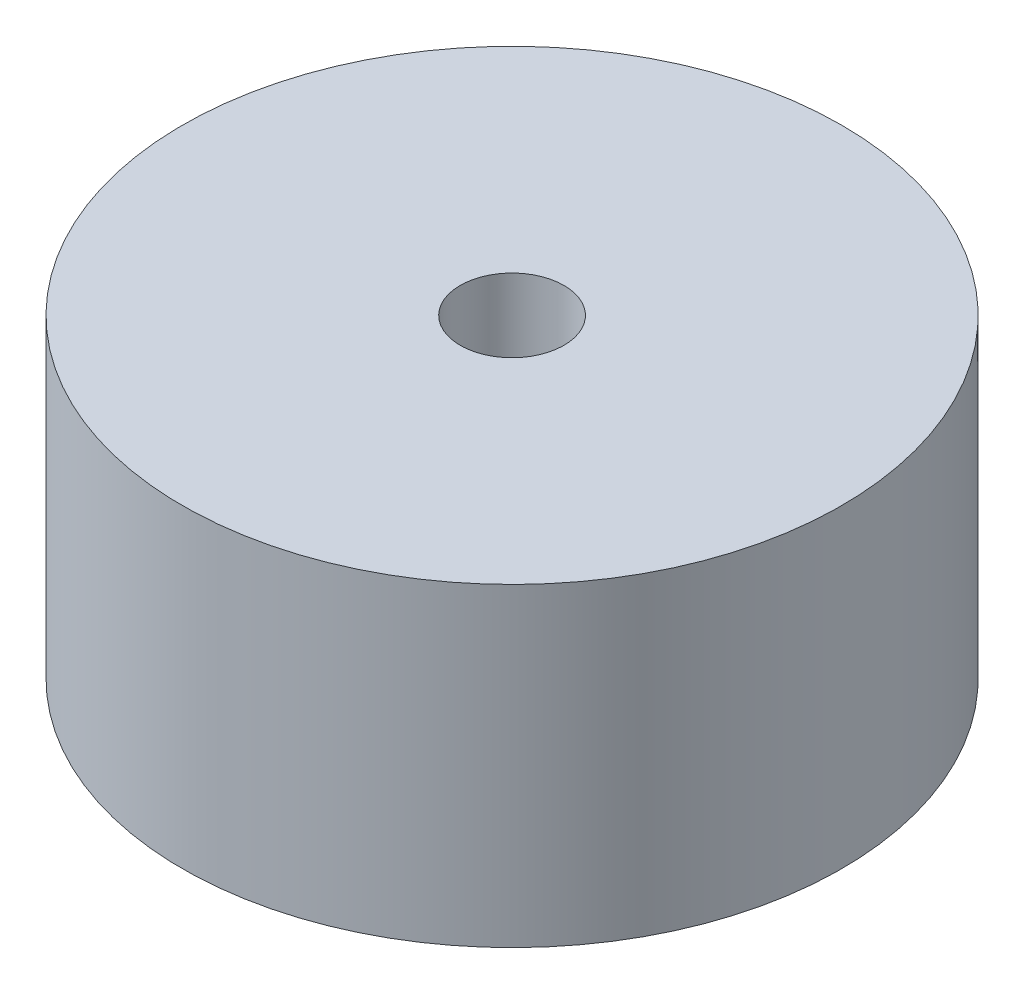
ISO-10303-21;
HEADER;
FILE_DESCRIPTION(('STEP AP214'),'2;1');
FILE_NAME('part.step','',(''),(''),'','','');
FILE_SCHEMA(('AUTOMOTIVE_DESIGN { 1 0 10303 214 1 1 1 1 }'));
ENDSEC;
DATA;
#1=APPLICATION_CONTEXT('core data for automotive mechanical design processes');
#2=APPLICATION_PROTOCOL_DEFINITION('international standard','automotive_design',2000,#1);
#3=PRODUCT_CONTEXT('',#1,'mechanical');
#4=PRODUCT('Part','Part','',(#3));
#5=PRODUCT_RELATED_PRODUCT_CATEGORY('part','',(#4));
#6=PRODUCT_DEFINITION_FORMATION('','',#4);
#7=PRODUCT_DEFINITION_CONTEXT('part definition',#1,'design');
#8=PRODUCT_DEFINITION('design','',#6,#7);
#9=PRODUCT_DEFINITION_SHAPE('','',#8);
#10=(LENGTH_UNIT() NAMED_UNIT(*) SI_UNIT(.MILLI.,.METRE.));
#11=(NAMED_UNIT(*) PLANE_ANGLE_UNIT() SI_UNIT($,.RADIAN.));
#12=(NAMED_UNIT(*) SI_UNIT($,.STERADIAN.) SOLID_ANGLE_UNIT());
#13=UNCERTAINTY_MEASURE_WITH_UNIT(LENGTH_MEASURE(1.E-05),#10,'distance_accuracy_value','');
#14=(GEOMETRIC_REPRESENTATION_CONTEXT(3) GLOBAL_UNCERTAINTY_ASSIGNED_CONTEXT((#13)) GLOBAL_UNIT_ASSIGNED_CONTEXT((#10,
#11,#12)) REPRESENTATION_CONTEXT('',''));
#15=CARTESIAN_POINT('',(0.,0.,0.));
#16=DIRECTION('',(0.,0.,1.));
#17=DIRECTION('',(1.,0.,0.));
#18=AXIS2_PLACEMENT_3D('',#15,#16,#17);
#19=CARTESIAN_POINT('',(0.,30.3,0.));
#20=DIRECTION('',(0.,-1.,0.));
#21=DIRECTION('',(0.,0.,-1.));
#22=AXIS2_PLACEMENT_3D('',#19,#20,#21);
#23=CYLINDRICAL_SURFACE('',#22,31.75);
#24=CARTESIAN_POINT('',(0.,30.3,0.));
#25=DIRECTION('',(0.,1.,0.));
#26=DIRECTION('',(0.,0.,1.));
#27=AXIS2_PLACEMENT_3D('',#24,#25,#26);
#28=CIRCLE('',#27,31.75);
#29=CARTESIAN_POINT('',(0.,30.3,-31.75));
#30=VERTEX_POINT('',#29);
#31=EDGE_CURVE('E10',#30,#30,#28,.T.);
#32=CARTESIAN_POINT('',(0.,0.,0.));
#33=DIRECTION('',(0.,1.,0.));
#34=DIRECTION('',(0.,0.,1.));
#35=AXIS2_PLACEMENT_3D('',#32,#33,#34);
#36=CIRCLE('',#35,31.75);
#37=CARTESIAN_POINT('',(0.,0.,-31.75));
#38=VERTEX_POINT('',#37);
#39=EDGE_CURVE('E39',#38,#38,#36,.T.);
#40=CARTESIAN_POINT('',(0.,30.3,-31.75));
#41=CARTESIAN_POINT('',(0.,29.984375,-31.75));
#42=CARTESIAN_POINT('',(0.,29.66875,-31.75));
#43=CARTESIAN_POINT('',(0.,29.0375,-31.75));
#44=CARTESIAN_POINT('',(0.,28.721875,-31.75));
#45=CARTESIAN_POINT('',(0.,28.090625,-31.75));
#46=CARTESIAN_POINT('',(0.,27.775,-31.75));
#47=CARTESIAN_POINT('',(0.,27.14375,-31.75));
#48=CARTESIAN_POINT('',(0.,26.828125,-31.75));
#49=CARTESIAN_POINT('',(0.,26.196875,-31.75));
#50=CARTESIAN_POINT('',(0.,25.88125,-31.75));
#51=CARTESIAN_POINT('',(0.,25.25,-31.75));
#52=CARTESIAN_POINT('',(0.,24.934375,-31.75));
#53=CARTESIAN_POINT('',(0.,24.303125,-31.75));
#54=CARTESIAN_POINT('',(0.,23.9875,-31.75));
#55=CARTESIAN_POINT('',(0.,23.35625,-31.75));
#56=CARTESIAN_POINT('',(0.,23.040625,-31.75));
#57=CARTESIAN_POINT('',(0.,22.409375,-31.75));
#58=CARTESIAN_POINT('',(0.,22.09375,-31.75));
#59=CARTESIAN_POINT('',(0.,21.4625,-31.75));
#60=CARTESIAN_POINT('',(0.,21.146875,-31.75));
#61=CARTESIAN_POINT('',(0.,20.515625,-31.75));
#62=CARTESIAN_POINT('',(0.,20.2,-31.75));
#63=CARTESIAN_POINT('',(0.,19.56875,-31.75));
#64=CARTESIAN_POINT('',(0.,19.253125,-31.75));
#65=CARTESIAN_POINT('',(0.,18.621875,-31.75));
#66=CARTESIAN_POINT('',(0.,18.30625,-31.75));
#67=CARTESIAN_POINT('',(0.,17.675,-31.75));
#68=CARTESIAN_POINT('',(0.,17.359375,-31.75));
#69=CARTESIAN_POINT('',(0.,16.728125,-31.75));
#70=CARTESIAN_POINT('',(0.,16.4125,-31.75));
#71=CARTESIAN_POINT('',(0.,15.78125,-31.75));
#72=CARTESIAN_POINT('',(0.,15.465625,-31.75));
#73=CARTESIAN_POINT('',(0.,14.834375,-31.75));
#74=CARTESIAN_POINT('',(0.,14.51875,-31.75));
#75=CARTESIAN_POINT('',(0.,13.8875,-31.75));
#76=CARTESIAN_POINT('',(0.,13.571875,-31.75));
#77=CARTESIAN_POINT('',(0.,12.940625,-31.75));
#78=CARTESIAN_POINT('',(0.,12.625,-31.75));
#79=CARTESIAN_POINT('',(0.,11.99375,-31.75));
#80=CARTESIAN_POINT('',(0.,11.678125,-31.75));
#81=CARTESIAN_POINT('',(0.,11.046875,-31.75));
#82=CARTESIAN_POINT('',(0.,10.73125,-31.75));
#83=CARTESIAN_POINT('',(0.,10.1,-31.75));
#84=CARTESIAN_POINT('',(0.,9.784375,-31.75));
#85=CARTESIAN_POINT('',(0.,9.153125,-31.75));
#86=CARTESIAN_POINT('',(0.,8.8375,-31.75));
#87=CARTESIAN_POINT('',(0.,8.20625,-31.75));
#88=CARTESIAN_POINT('',(0.,7.890625,-31.75));
#89=CARTESIAN_POINT('',(0.,7.259375,-31.75));
#90=CARTESIAN_POINT('',(0.,6.94375,-31.75));
#91=CARTESIAN_POINT('',(0.,6.3125,-31.75));
#92=CARTESIAN_POINT('',(0.,5.996875,-31.75));
#93=CARTESIAN_POINT('',(0.,5.365625,-31.75));
#94=CARTESIAN_POINT('',(0.,5.05,-31.75));
#95=CARTESIAN_POINT('',(0.,4.41875,-31.75));
#96=CARTESIAN_POINT('',(0.,4.103125,-31.75));
#97=CARTESIAN_POINT('',(0.,3.471875,-31.75));
#98=CARTESIAN_POINT('',(0.,3.15625,-31.75));
#99=CARTESIAN_POINT('',(0.,2.525,-31.75));
#100=CARTESIAN_POINT('',(0.,2.209375,-31.75));
#101=CARTESIAN_POINT('',(0.,1.578125,-31.75));
#102=CARTESIAN_POINT('',(0.,1.2625,-31.75));
#103=CARTESIAN_POINT('',(0.,0.631249999999997,-31.75));
#104=CARTESIAN_POINT('',(0.,0.315624999999997,-31.75));
#105=CARTESIAN_POINT('',(0.,0.,-31.75));
#106=B_SPLINE_CURVE_WITH_KNOTS('',3,(#40,#41,#42,#43,#44,#45,#46,#47,#48,#49,#50,#51,#52,#53,
#54,#55,#56,#57,#58,#59,#60,#61,#62,#63,#64,#65,#66,#67,#68,#69,#70,#71,#72,#73,#74,#75,#76,#77,
#78,#79,#80,#81,#82,#83,#84,#85,#86,#87,#88,#89,#90,#91,#92,#93,#94,#95,#96,#97,#98,#99,#100,
#101,#102,#103,#104,#105),.UNSPECIFIED.,.F.,.F.,(4,2,2,2,2,2,2,2,2,2,2,2,2,2,2,2,2,2,2,2,2,2,2,
2,2,2,2,2,2,2,2,2,4),(0.,0.946875,1.89375,2.840625,3.7875,4.734375,5.68125,6.628125,7.575,
8.521875,9.46875,10.415625,11.3625,12.309375,13.25625,14.203125,15.15,16.096875,17.04375,
17.990625,18.9375,19.884375,20.83125,21.778125,22.725,23.671875,24.61875,25.565625,26.5125,
27.459375,28.40625,29.353125,30.3),.UNSPECIFIED.);
#107=EDGE_CURVE('BSEAM38',#30,#38,#106,.T.);
#108=ORIENTED_EDGE('',*,*,#31,.F.);
#109=ORIENTED_EDGE('',*,*,#39,.T.);
#110=ORIENTED_EDGE('',*,*,#107,.T.);
#111=ORIENTED_EDGE('',*,*,#107,.F.);
#112=EDGE_LOOP('',(#108,#110,#109,#111));
#113=FACE_BOUND('',#112,.T.);
#114=ADVANCED_FACE('F38',(#113),#23,.T.);
#115=CARTESIAN_POINT('',(0.,30.3,0.));
#116=DIRECTION('',(0.,1.,0.));
#117=DIRECTION('',(0.,0.,1.));
#118=AXIS2_PLACEMENT_3D('',#115,#116,#117);
#119=PLANE('',#118);
#120=CARTESIAN_POINT('',(0.,30.3,0.));
#121=DIRECTION('',(0.,-1.,0.));
#122=DIRECTION('',(0.,0.,-1.));
#123=AXIS2_PLACEMENT_3D('',#120,#121,#122);
#124=CIRCLE('',#123,5.);
#125=CARTESIAN_POINT('',(0.,30.3,-5.));
#126=VERTEX_POINT('',#125);
#127=EDGE_CURVE('E46',#126,#126,#124,.T.);
#128=ORIENTED_EDGE('',*,*,#127,.T.);
#129=EDGE_LOOP('',(#128));
#130=FACE_BOUND('',#129,.T.);
#131=ORIENTED_EDGE('',*,*,#31,.T.);
#132=EDGE_LOOP('',(#131));
#133=FACE_BOUND('',#132,.T.);
#134=ADVANCED_FACE('F53',(#130,#133),#119,.T.);
#135=CARTESIAN_POINT('',(0.,0.,0.));
#136=DIRECTION('',(0.,1.,0.));
#137=DIRECTION('',(0.,0.,1.));
#138=AXIS2_PLACEMENT_3D('',#135,#136,#137);
#139=PLANE('',#138);
#140=CARTESIAN_POINT('',(0.,0.,0.));
#141=DIRECTION('',(0.,-1.,0.));
#142=DIRECTION('',(0.,0.,-1.));
#143=AXIS2_PLACEMENT_3D('',#140,#141,#142);
#144=CIRCLE('',#143,5.);
#145=CARTESIAN_POINT('',(0.,0.,-5.));
#146=VERTEX_POINT('',#145);
#147=EDGE_CURVE('E48',#146,#146,#144,.T.);
#148=ORIENTED_EDGE('',*,*,#147,.F.);
#149=EDGE_LOOP('',(#148));
#150=FACE_BOUND('',#149,.T.);
#151=ORIENTED_EDGE('',*,*,#39,.F.);
#152=EDGE_LOOP('',(#151));
#153=FACE_BOUND('',#152,.T.);
#154=ADVANCED_FACE('F56',(#150,#153),#139,.F.);
#155=CARTESIAN_POINT('',(0.,30.3,0.));
#156=DIRECTION('',(0.,-1.,0.));
#157=DIRECTION('',(0.,0.,-1.));
#158=AXIS2_PLACEMENT_3D('',#155,#156,#157);
#159=CYLINDRICAL_SURFACE('',#158,5.);
#160=CARTESIAN_POINT('',(0.,30.3,-5.));
#161=CARTESIAN_POINT('',(0.,29.984375,-5.));
#162=CARTESIAN_POINT('',(0.,29.66875,-5.));
#163=CARTESIAN_POINT('',(0.,29.0375,-5.));
#164=CARTESIAN_POINT('',(0.,28.721875,-5.));
#165=CARTESIAN_POINT('',(0.,28.090625,-5.));
#166=CARTESIAN_POINT('',(0.,27.775,-5.));
#167=CARTESIAN_POINT('',(0.,27.14375,-5.));
#168=CARTESIAN_POINT('',(0.,26.828125,-5.));
#169=CARTESIAN_POINT('',(0.,26.196875,-5.));
#170=CARTESIAN_POINT('',(0.,25.88125,-5.));
#171=CARTESIAN_POINT('',(0.,25.25,-5.));
#172=CARTESIAN_POINT('',(0.,24.934375,-5.));
#173=CARTESIAN_POINT('',(0.,24.303125,-5.));
#174=CARTESIAN_POINT('',(0.,23.9875,-5.));
#175=CARTESIAN_POINT('',(0.,23.35625,-5.));
#176=CARTESIAN_POINT('',(0.,23.040625,-5.));
#177=CARTESIAN_POINT('',(0.,22.409375,-5.));
#178=CARTESIAN_POINT('',(0.,22.09375,-5.));
#179=CARTESIAN_POINT('',(0.,21.4625,-5.));
#180=CARTESIAN_POINT('',(0.,21.146875,-5.));
#181=CARTESIAN_POINT('',(0.,20.515625,-5.));
#182=CARTESIAN_POINT('',(0.,20.2,-5.));
#183=CARTESIAN_POINT('',(0.,19.56875,-5.));
#184=CARTESIAN_POINT('',(0.,19.253125,-5.));
#185=CARTESIAN_POINT('',(0.,18.621875,-5.));
#186=CARTESIAN_POINT('',(0.,18.30625,-5.));
#187=CARTESIAN_POINT('',(0.,17.675,-5.));
#188=CARTESIAN_POINT('',(0.,17.359375,-5.));
#189=CARTESIAN_POINT('',(0.,16.728125,-5.));
#190=CARTESIAN_POINT('',(0.,16.4125,-5.));
#191=CARTESIAN_POINT('',(0.,15.78125,-5.));
#192=CARTESIAN_POINT('',(0.,15.465625,-5.));
#193=CARTESIAN_POINT('',(0.,14.834375,-5.));
#194=CARTESIAN_POINT('',(0.,14.51875,-5.));
#195=CARTESIAN_POINT('',(0.,13.8875,-5.));
#196=CARTESIAN_POINT('',(0.,13.571875,-5.));
#197=CARTESIAN_POINT('',(0.,12.940625,-5.));
#198=CARTESIAN_POINT('',(0.,12.625,-5.));
#199=CARTESIAN_POINT('',(0.,11.99375,-5.));
#200=CARTESIAN_POINT('',(0.,11.678125,-5.));
#201=CARTESIAN_POINT('',(0.,11.046875,-5.));
#202=CARTESIAN_POINT('',(0.,10.73125,-5.));
#203=CARTESIAN_POINT('',(0.,10.1,-5.));
#204=CARTESIAN_POINT('',(0.,9.784375,-5.));
#205=CARTESIAN_POINT('',(0.,9.153125,-5.));
#206=CARTESIAN_POINT('',(0.,8.83750000000001,-5.));
#207=CARTESIAN_POINT('',(0.,8.20625,-5.));
#208=CARTESIAN_POINT('',(0.,7.890625,-5.));
#209=CARTESIAN_POINT('',(0.,7.259375,-5.));
#210=CARTESIAN_POINT('',(0.,6.94375,-5.));
#211=CARTESIAN_POINT('',(0.,6.3125,-5.));
#212=CARTESIAN_POINT('',(0.,5.996875,-5.));
#213=CARTESIAN_POINT('',(0.,5.365625,-5.));
#214=CARTESIAN_POINT('',(0.,5.05,-5.));
#215=CARTESIAN_POINT('',(0.,4.41875,-5.));
#216=CARTESIAN_POINT('',(0.,4.103125,-5.));
#217=CARTESIAN_POINT('',(0.,3.471875,-5.));
#218=CARTESIAN_POINT('',(0.,3.15625,-5.));
#219=CARTESIAN_POINT('',(0.,2.525,-5.));
#220=CARTESIAN_POINT('',(0.,2.209375,-5.));
#221=CARTESIAN_POINT('',(0.,1.578125,-5.));
#222=CARTESIAN_POINT('',(0.,1.2625,-5.));
#223=CARTESIAN_POINT('',(0.,0.631250000000004,-5.));
#224=CARTESIAN_POINT('',(0.,0.315625000000004,-5.));
#225=CARTESIAN_POINT('',(0.,0.,-5.));
#226=B_SPLINE_CURVE_WITH_KNOTS('',3,(#160,#161,#162,#163,#164,#165,#166,#167,#168,#169,#170,
#171,#172,#173,#174,#175,#176,#177,#178,#179,#180,#181,#182,#183,#184,#185,#186,#187,#188,#189,
#190,#191,#192,#193,#194,#195,#196,#197,#198,#199,#200,#201,#202,#203,#204,#205,#206,#207,#208,
#209,#210,#211,#212,#213,#214,#215,#216,#217,#218,#219,#220,#221,#222,#223,#224,#225),
.UNSPECIFIED.,.F.,.F.,(4,2,2,2,2,2,2,2,2,2,2,2,2,2,2,2,2,2,2,2,2,2,2,2,2,2,2,2,2,2,2,2,4),(0.,
0.946875,1.89375,2.840625,3.7875,4.734375,5.68125,6.628125,7.575,8.521875,9.46875,10.415625,
11.3625,12.309375,13.25625,14.203125,15.15,16.096875,17.04375,17.990625,18.9375,19.884375,
20.83125,21.778125,22.725,23.671875,24.61875,25.565625,26.5125,27.459375,28.40625,29.353125,
30.3),.UNSPECIFIED.);
#227=EDGE_CURVE('BSEAM57',#126,#146,#226,.T.);
#228=ORIENTED_EDGE('',*,*,#127,.F.);
#229=ORIENTED_EDGE('',*,*,#147,.T.);
#230=ORIENTED_EDGE('',*,*,#227,.T.);
#231=ORIENTED_EDGE('',*,*,#227,.F.);
#232=EDGE_LOOP('',(#228,#230,#229,#231));
#233=FACE_BOUND('',#232,.T.);
#234=ADVANCED_FACE('F57',(#233),#159,.F.);
#235=CLOSED_SHELL('',(#114,#134,#154,#234));
#236=MANIFOLD_SOLID_BREP('B2',#235);
#237=ADVANCED_BREP_SHAPE_REPRESENTATION('',(#18,#236),#14);
#238=SHAPE_DEFINITION_REPRESENTATION(#9,#237);
ENDSEC;
END-ISO-10303-21;
